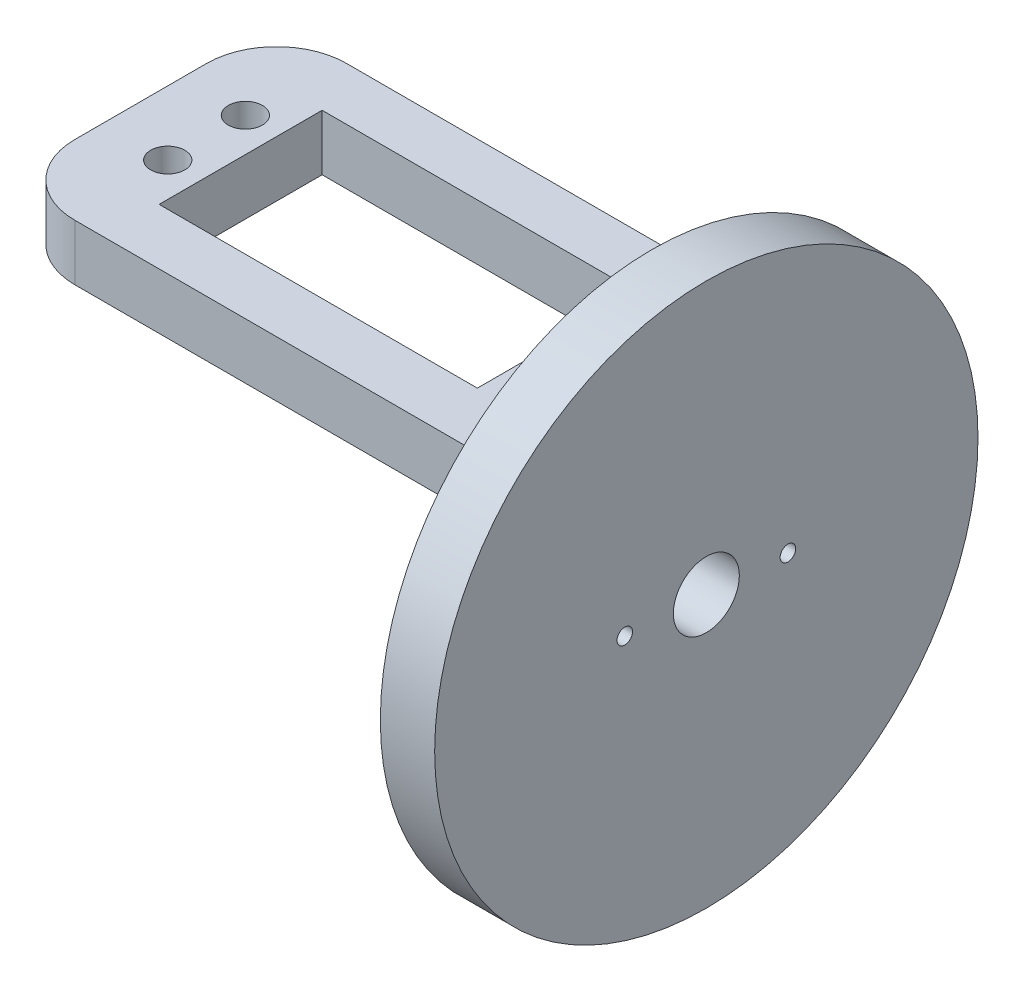
ISO-10303-21;
HEADER;
FILE_DESCRIPTION(('STEP AP214'),'2;1');
FILE_NAME('part.step','',(''),(''),'','','');
FILE_SCHEMA(('AUTOMOTIVE_DESIGN { 1 0 10303 214 1 1 1 1 }'));
ENDSEC;
DATA;
#1=APPLICATION_CONTEXT('core data for automotive mechanical design processes');
#2=APPLICATION_PROTOCOL_DEFINITION('international standard','automotive_design',2000,#1);
#3=PRODUCT_CONTEXT('',#1,'mechanical');
#4=PRODUCT('Part','Part','',(#3));
#5=PRODUCT_RELATED_PRODUCT_CATEGORY('part','',(#4));
#6=PRODUCT_DEFINITION_FORMATION('','',#4);
#7=PRODUCT_DEFINITION_CONTEXT('part definition',#1,'design');
#8=PRODUCT_DEFINITION('design','',#6,#7);
#9=PRODUCT_DEFINITION_SHAPE('','',#8);
#10=(LENGTH_UNIT() NAMED_UNIT(*) SI_UNIT(.MILLI.,.METRE.));
#11=(NAMED_UNIT(*) PLANE_ANGLE_UNIT() SI_UNIT($,.RADIAN.));
#12=(NAMED_UNIT(*) SI_UNIT($,.STERADIAN.) SOLID_ANGLE_UNIT());
#13=UNCERTAINTY_MEASURE_WITH_UNIT(LENGTH_MEASURE(1.E-05),#10,'distance_accuracy_value','');
#14=(GEOMETRIC_REPRESENTATION_CONTEXT(3) GLOBAL_UNCERTAINTY_ASSIGNED_CONTEXT((#13)) GLOBAL_UNIT_ASSIGNED_CONTEXT((#10,
#11,#12)) REPRESENTATION_CONTEXT('',''));
#15=CARTESIAN_POINT('',(0.,0.,0.));
#16=DIRECTION('',(0.,0.,1.));
#17=DIRECTION('',(1.,0.,0.));
#18=AXIS2_PLACEMENT_3D('',#15,#16,#17);
#19=CARTESIAN_POINT('',(-47.8051071083567,7.2,-16.6319835709951));
#20=DIRECTION('',(1.,0.,0.));
#21=DIRECTION('',(0.,0.,-1.));
#22=AXIS2_PLACEMENT_3D('',#19,#20,#21);
#23=PLANE('',#22);
#24=DIRECTION('',(0.,0.,1.));
#25=VECTOR('',#24,1.);
#26=CARTESIAN_POINT('',(-47.8051071083567,0.,-16.6319835709951));
#27=LINE('',#26,#25);
#28=CARTESIAN_POINT('',(-47.8051071083567,0.,-7.63198357099514));
#29=VERTEX_POINT('',#28);
#30=CARTESIAN_POINT('',(-47.8051071083567,0.,9.36801642900486));
#31=VERTEX_POINT('',#30);
#32=EDGE_CURVE('E167',#29,#31,#27,.T.);
#33=ORIENTED_EDGE('',*,*,#32,.T.);
#34=DIRECTION('',(0.,-1.,0.));
#35=VECTOR('',#34,1.);
#36=CARTESIAN_POINT('',(-47.8051071083567,7.2,9.36801642900486));
#37=LINE('',#36,#35);
#38=CARTESIAN_POINT('',(-47.8051071083567,7.2,9.36801642900486));
#39=VERTEX_POINT('',#38);
#40=EDGE_CURVE('E206',#31,#39,#37,.F.);
#41=ORIENTED_EDGE('',*,*,#40,.T.);
#42=DIRECTION('',(0.,0.,1.));
#43=VECTOR('',#42,1.);
#44=CARTESIAN_POINT('',(-47.8051071083567,7.2,-16.6319835709951));
#45=LINE('',#44,#43);
#46=CARTESIAN_POINT('',(-47.8051071083567,7.2,-7.63198357099514));
#47=VERTEX_POINT('',#46);
#48=EDGE_CURVE('E170',#47,#39,#45,.T.);
#49=ORIENTED_EDGE('',*,*,#48,.F.);
#50=DIRECTION('',(0.,-1.,0.));
#51=VECTOR('',#50,1.);
#52=CARTESIAN_POINT('',(-47.8051071083567,7.2,-7.63198357099514));
#53=LINE('',#52,#51);
#54=EDGE_CURVE('E203',#47,#29,#53,.T.);
#55=ORIENTED_EDGE('',*,*,#54,.T.);
#56=EDGE_LOOP('',(#33,#41,#49,#55));
#57=FACE_BOUND('',#56,.T.);
#58=ADVANCED_FACE('F33',(#57),#23,.F.);
#59=CARTESIAN_POINT('',(-47.8051071083567,7.2,18.3680164290049));
#60=DIRECTION('',(0.,0.,-1.));
#61=DIRECTION('',(-1.,0.,0.));
#62=AXIS2_PLACEMENT_3D('',#59,#60,#61);
#63=PLANE('',#62);
#64=DIRECTION('',(1.,0.,0.));
#65=VECTOR('',#64,1.);
#66=CARTESIAN_POINT('',(-47.8051071083567,7.2,18.3680164290049));
#67=LINE('',#66,#65);
#68=CARTESIAN_POINT('',(-38.8051071083567,7.2,18.3680164290049));
#69=VERTEX_POINT('',#68);
#70=CARTESIAN_POINT('',(17.1948928916433,7.2,18.3680164290049));
#71=VERTEX_POINT('',#70);
#72=EDGE_CURVE('E173',#69,#71,#67,.T.);
#73=ORIENTED_EDGE('',*,*,#72,.F.);
#74=DIRECTION('',(0.,-1.,0.));
#75=VECTOR('',#74,1.);
#76=CARTESIAN_POINT('',(-38.8051071083567,7.2,18.3680164290049));
#77=LINE('',#76,#75);
#78=CARTESIAN_POINT('',(-38.8051071083567,0.,18.3680164290049));
#79=VERTEX_POINT('',#78);
#80=EDGE_CURVE('E196',#69,#79,#77,.T.);
#81=ORIENTED_EDGE('',*,*,#80,.T.);
#82=DIRECTION('',(1.,0.,0.));
#83=VECTOR('',#82,1.);
#84=CARTESIAN_POINT('',(-47.8051071083567,0.,18.3680164290049));
#85=LINE('',#84,#83);
#86=CARTESIAN_POINT('',(17.1948928916433,0.,18.3680164290049));
#87=VERTEX_POINT('',#86);
#88=EDGE_CURVE('E184',#79,#87,#85,.T.);
#89=ORIENTED_EDGE('',*,*,#88,.T.);
#90=DIRECTION('',(0.,-1.,0.));
#91=VECTOR('',#90,1.);
#92=CARTESIAN_POINT('',(17.1948928916433,7.2,18.3680164290049));
#93=LINE('',#92,#91);
#94=EDGE_CURVE('E193',#71,#87,#93,.T.);
#95=ORIENTED_EDGE('',*,*,#94,.F.);
#96=EDGE_LOOP('',(#73,#81,#89,#95));
#97=FACE_BOUND('',#96,.T.);
#98=ADVANCED_FACE('F219',(#97),#63,.F.);
#99=CARTESIAN_POINT('',(-47.8051071083567,7.2,-16.6319835709951));
#100=DIRECTION('',(0.,0.,1.));
#101=DIRECTION('',(1.,0.,0.));
#102=AXIS2_PLACEMENT_3D('',#99,#100,#101);
#103=PLANE('',#102);
#104=DIRECTION('',(-1.,0.,0.));
#105=VECTOR('',#104,1.);
#106=CARTESIAN_POINT('',(-47.8051071083567,0.,-16.6319835709951));
#107=LINE('',#106,#105);
#108=CARTESIAN_POINT('',(17.1948928916433,0.,-16.6319835709951));
#109=VERTEX_POINT('',#108);
#110=CARTESIAN_POINT('',(-38.8051071083567,0.,-16.6319835709951));
#111=VERTEX_POINT('',#110);
#112=EDGE_CURVE('E174',#109,#111,#107,.T.);
#113=ORIENTED_EDGE('',*,*,#112,.T.);
#114=DIRECTION('',(0.,-1.,0.));
#115=VECTOR('',#114,1.);
#116=CARTESIAN_POINT('',(-38.8051071083567,7.2,-16.6319835709951));
#117=LINE('',#116,#115);
#118=CARTESIAN_POINT('',(-38.8051071083567,7.2,-16.6319835709951));
#119=VERTEX_POINT('',#118);
#120=EDGE_CURVE('E11',#111,#119,#117,.F.);
#121=ORIENTED_EDGE('',*,*,#120,.T.);
#122=DIRECTION('',(-1.,0.,0.));
#123=VECTOR('',#122,1.);
#124=CARTESIAN_POINT('',(-47.8051071083567,7.2,-16.6319835709951));
#125=LINE('',#124,#123);
#126=CARTESIAN_POINT('',(17.1948928916433,7.2,-16.6319835709951));
#127=VERTEX_POINT('',#126);
#128=EDGE_CURVE('E178',#127,#119,#125,.T.);
#129=ORIENTED_EDGE('',*,*,#128,.F.);
#130=DIRECTION('',(0.,-1.,0.));
#131=VECTOR('',#130,1.);
#132=CARTESIAN_POINT('',(17.1948928916433,7.2,-16.6319835709951));
#133=LINE('',#132,#131);
#134=EDGE_CURVE('E181',#127,#109,#133,.T.);
#135=ORIENTED_EDGE('',*,*,#134,.T.);
#136=EDGE_LOOP('',(#113,#121,#129,#135));
#137=FACE_BOUND('',#136,.T.);
#138=ADVANCED_FACE('F231',(#137),#103,.F.);
#139=CARTESIAN_POINT('',(0.,7.2,0.));
#140=DIRECTION('',(0.,1.,0.));
#141=DIRECTION('',(0.,0.,1.));
#142=AXIS2_PLACEMENT_3D('',#139,#140,#141);
#143=PLANE('',#142);
#144=CARTESIAN_POINT('',(-39.5254301155466,7.2,-4.33198357099514));
#145=DIRECTION('',(0.,1.,0.));
#146=DIRECTION('',(0.,0.,1.));
#147=AXIS2_PLACEMENT_3D('',#144,#145,#146);
#148=CIRCLE('',#147,2.20000000006193);
#149=CARTESIAN_POINT('',(-39.5254301155466,7.2,-2.13198357093321));
#150=VERTEX_POINT('',#149);
#151=EDGE_CURVE('E422',#150,#150,#148,.T.);
#152=ORIENTED_EDGE('',*,*,#151,.F.);
#153=EDGE_LOOP('',(#152));
#154=FACE_BOUND('',#153,.T.);
#155=CARTESIAN_POINT('',(-39.5254301155466,7.2,5.66801642900486));
#156=DIRECTION('',(0.,1.,0.));
#157=DIRECTION('',(0.,0.,1.));
#158=AXIS2_PLACEMENT_3D('',#155,#156,#157);
#159=CIRCLE('',#158,2.2000000001223);
#160=CARTESIAN_POINT('',(-39.5254301155466,7.2,7.86801642912716));
#161=VERTEX_POINT('',#160);
#162=EDGE_CURVE('E425',#161,#161,#159,.T.);
#163=ORIENTED_EDGE('',*,*,#162,.F.);
#164=EDGE_LOOP('',(#163));
#165=FACE_BOUND('',#164,.T.);
#166=CARTESIAN_POINT('',(10.2537964864071,7.2,5.66801642900484));
#167=DIRECTION('',(0.,1.,0.));
#168=DIRECTION('',(0.,0.,1.));
#169=AXIS2_PLACEMENT_3D('',#166,#167,#168);
#170=CIRCLE('',#169,2.20000000006728);
#171=CARTESIAN_POINT('',(10.2537964864071,7.2,7.86801642907212));
#172=VERTEX_POINT('',#171);
#173=EDGE_CURVE('E442',#172,#172,#170,.T.);
#174=ORIENTED_EDGE('',*,*,#173,.F.);
#175=EDGE_LOOP('',(#174));
#176=FACE_BOUND('',#175,.T.);
#177=CARTESIAN_POINT('',(10.2571502329024,7.2,-4.32491084017674));
#178=DIRECTION('',(0.,1.,0.));
#179=DIRECTION('',(0.,0.,1.));
#180=AXIS2_PLACEMENT_3D('',#177,#178,#179);
#181=CIRCLE('',#180,2.19217241181564);
#182=CARTESIAN_POINT('',(10.2571502329024,7.2,-2.1327384283611));
#183=VERTEX_POINT('',#182);
#184=EDGE_CURVE('E434',#183,#183,#181,.T.);
#185=ORIENTED_EDGE('',*,*,#184,.F.);
#186=EDGE_LOOP('',(#185));
#187=FACE_BOUND('',#186,.T.);
#188=DIRECTION('',(0.,0.,-1.));
#189=VECTOR('',#188,1.);
#190=CARTESIAN_POINT('',(5.86418318543995,7.2,-9.83198357100003));
#191=LINE('',#190,#189);
#192=CARTESIAN_POINT('',(5.86418318543995,7.2,11.168016429));
#193=VERTEX_POINT('',#192);
#194=CARTESIAN_POINT('',(5.86418318543995,7.2,-9.83198357100003));
#195=VERTEX_POINT('',#194);
#196=EDGE_CURVE('E48',#193,#195,#191,.T.);
#197=ORIENTED_EDGE('',*,*,#196,.F.);
#198=DIRECTION('',(1.,0.,0.));
#199=VECTOR('',#198,1.);
#200=CARTESIAN_POINT('',(-35.1358168145601,7.2,11.168016429));
#201=LINE('',#200,#199);
#202=CARTESIAN_POINT('',(-35.1358168145601,7.2,11.168016429));
#203=VERTEX_POINT('',#202);
#204=EDGE_CURVE('E117',#203,#193,#201,.T.);
#205=ORIENTED_EDGE('',*,*,#204,.F.);
#206=DIRECTION('',(0.,0.,1.));
#207=VECTOR('',#206,1.);
#208=CARTESIAN_POINT('',(-35.1358168145601,7.2,-9.83198357100003));
#209=LINE('',#208,#207);
#210=CARTESIAN_POINT('',(-35.1358168145601,7.2,-9.83198357100003));
#211=VERTEX_POINT('',#210);
#212=EDGE_CURVE('E137',#211,#203,#209,.T.);
#213=ORIENTED_EDGE('',*,*,#212,.F.);
#214=DIRECTION('',(-1.,0.,0.));
#215=VECTOR('',#214,1.);
#216=CARTESIAN_POINT('',(-35.1358168145601,7.2,-9.83198357100003));
#217=LINE('',#216,#215);
#218=EDGE_CURVE('E131',#195,#211,#217,.T.);
#219=ORIENTED_EDGE('',*,*,#218,.F.);
#220=EDGE_LOOP('',(#197,#205,#213,#219));
#221=FACE_BOUND('',#220,.T.);
#222=ORIENTED_EDGE('',*,*,#48,.T.);
#223=CARTESIAN_POINT('',(-38.8051071083567,7.2,9.36801642900486));
#224=DIRECTION('',(0.,1.,0.));
#225=DIRECTION('',(0.,0.,1.));
#226=AXIS2_PLACEMENT_3D('',#223,#224,#225);
#227=CIRCLE('',#226,9.);
#228=EDGE_CURVE('E41',#39,#69,#227,.T.);
#229=ORIENTED_EDGE('',*,*,#228,.T.);
#230=ORIENTED_EDGE('',*,*,#72,.T.);
#231=DIRECTION('',(0.,0.,-1.));
#232=VECTOR('',#231,1.);
#233=CARTESIAN_POINT('',(17.1948928916433,7.2,-16.6319835709951));
#234=LINE('',#233,#232);
#235=EDGE_CURVE('E176',#71,#127,#234,.T.);
#236=ORIENTED_EDGE('',*,*,#235,.T.);
#237=ORIENTED_EDGE('',*,*,#128,.T.);
#238=CARTESIAN_POINT('',(-38.8051071083567,7.2,-7.63198357099514));
#239=DIRECTION('',(0.,1.,0.));
#240=DIRECTION('',(0.,0.,1.));
#241=AXIS2_PLACEMENT_3D('',#238,#239,#240);
#242=CIRCLE('',#241,9.);
#243=EDGE_CURVE('E208',#119,#47,#242,.T.);
#244=ORIENTED_EDGE('',*,*,#243,.T.);
#245=EDGE_LOOP('',(#222,#229,#230,#236,#237,#244));
#246=FACE_BOUND('',#245,.T.);
#247=ADVANCED_FACE('F212',(#154,#165,#176,#187,#221,#246),#143,.T.);
#248=CARTESIAN_POINT('',(0.,0.,0.));
#249=DIRECTION('',(0.,1.,0.));
#250=DIRECTION('',(0.,0.,1.));
#251=AXIS2_PLACEMENT_3D('',#248,#249,#250);
#252=PLANE('',#251);
#253=CARTESIAN_POINT('',(-39.5254301155466,0.,-4.33198357099514));
#254=DIRECTION('',(0.,1.,0.));
#255=DIRECTION('',(0.,0.,1.));
#256=AXIS2_PLACEMENT_3D('',#253,#254,#255);
#257=CIRCLE('',#256,2.20000000006193);
#258=CARTESIAN_POINT('',(-39.5254301155466,0.,-2.13198357093321));
#259=VERTEX_POINT('',#258);
#260=EDGE_CURVE('E424',#259,#259,#257,.F.);
#261=ORIENTED_EDGE('',*,*,#260,.F.);
#262=EDGE_LOOP('',(#261));
#263=FACE_BOUND('',#262,.T.);
#264=CARTESIAN_POINT('',(-39.5254301155466,0.,5.66801642900486));
#265=DIRECTION('',(0.,1.,0.));
#266=DIRECTION('',(0.,0.,1.));
#267=AXIS2_PLACEMENT_3D('',#264,#265,#266);
#268=CIRCLE('',#267,2.2000000001223);
#269=CARTESIAN_POINT('',(-39.5254301155466,0.,7.86801642912716));
#270=VERTEX_POINT('',#269);
#271=EDGE_CURVE('E428',#270,#270,#268,.F.);
#272=ORIENTED_EDGE('',*,*,#271,.F.);
#273=EDGE_LOOP('',(#272));
#274=FACE_BOUND('',#273,.T.);
#275=CARTESIAN_POINT('',(10.2537964864071,0.,5.66801642900484));
#276=DIRECTION('',(0.,1.,0.));
#277=DIRECTION('',(0.,0.,1.));
#278=AXIS2_PLACEMENT_3D('',#275,#276,#277);
#279=CIRCLE('',#278,2.20000000006728);
#280=CARTESIAN_POINT('',(10.2537964864071,0.,7.86801642907212));
#281=VERTEX_POINT('',#280);
#282=EDGE_CURVE('E439',#281,#281,#279,.F.);
#283=ORIENTED_EDGE('',*,*,#282,.F.);
#284=EDGE_LOOP('',(#283));
#285=FACE_BOUND('',#284,.T.);
#286=CARTESIAN_POINT('',(10.2571502329024,0.,-4.32491084017674));
#287=DIRECTION('',(0.,1.,0.));
#288=DIRECTION('',(0.,0.,1.));
#289=AXIS2_PLACEMENT_3D('',#286,#287,#288);
#290=CIRCLE('',#289,2.19217241181564);
#291=CARTESIAN_POINT('',(10.2571502329024,0.,-2.1327384283611));
#292=VERTEX_POINT('',#291);
#293=EDGE_CURVE('E432',#292,#292,#290,.F.);
#294=ORIENTED_EDGE('',*,*,#293,.F.);
#295=EDGE_LOOP('',(#294));
#296=FACE_BOUND('',#295,.T.);
#297=DIRECTION('',(-1.,0.,0.));
#298=VECTOR('',#297,1.);
#299=CARTESIAN_POINT('',(-35.1358168145601,0.,11.168016429));
#300=LINE('',#299,#298);
#301=CARTESIAN_POINT('',(5.86418318543995,0.,11.168016429));
#302=VERTEX_POINT('',#301);
#303=CARTESIAN_POINT('',(-35.1358168145601,0.,11.168016429));
#304=VERTEX_POINT('',#303);
#305=EDGE_CURVE('E129',#302,#304,#300,.T.);
#306=ORIENTED_EDGE('',*,*,#305,.F.);
#307=DIRECTION('',(0.,0.,1.));
#308=VECTOR('',#307,1.);
#309=CARTESIAN_POINT('',(5.86418318543995,0.,-9.83198357100003));
#310=LINE('',#309,#308);
#311=CARTESIAN_POINT('',(5.86418318543995,0.,-9.83198357100003));
#312=VERTEX_POINT('',#311);
#313=EDGE_CURVE('E111',#312,#302,#310,.T.);
#314=ORIENTED_EDGE('',*,*,#313,.F.);
#315=DIRECTION('',(1.,0.,0.));
#316=VECTOR('',#315,1.);
#317=CARTESIAN_POINT('',(-35.1358168145601,0.,-9.83198357100003));
#318=LINE('',#317,#316);
#319=CARTESIAN_POINT('',(-35.1358168145601,0.,-9.83198357100003));
#320=VERTEX_POINT('',#319);
#321=EDGE_CURVE('E120',#320,#312,#318,.T.);
#322=ORIENTED_EDGE('',*,*,#321,.F.);
#323=DIRECTION('',(0.,0.,-1.));
#324=VECTOR('',#323,1.);
#325=CARTESIAN_POINT('',(-35.1358168145601,0.,-9.83198357100003));
#326=LINE('',#325,#324);
#327=EDGE_CURVE('E56',#304,#320,#326,.T.);
#328=ORIENTED_EDGE('',*,*,#327,.F.);
#329=EDGE_LOOP('',(#306,#314,#322,#328));
#330=FACE_BOUND('',#329,.T.);
#331=ORIENTED_EDGE('',*,*,#88,.F.);
#332=CARTESIAN_POINT('',(-38.8051071083567,0.,9.36801642900486));
#333=DIRECTION('',(0.,1.,0.));
#334=DIRECTION('',(0.,0.,1.));
#335=AXIS2_PLACEMENT_3D('',#332,#333,#334);
#336=CIRCLE('',#335,9.);
#337=EDGE_CURVE('E201',#79,#31,#336,.F.);
#338=ORIENTED_EDGE('',*,*,#337,.T.);
#339=ORIENTED_EDGE('',*,*,#32,.F.);
#340=CARTESIAN_POINT('',(-38.8051071083567,0.,-7.63198357099514));
#341=DIRECTION('',(0.,1.,0.));
#342=DIRECTION('',(0.,0.,1.));
#343=AXIS2_PLACEMENT_3D('',#340,#341,#342);
#344=CIRCLE('',#343,9.);
#345=EDGE_CURVE('E199',#29,#111,#344,.F.);
#346=ORIENTED_EDGE('',*,*,#345,.T.);
#347=ORIENTED_EDGE('',*,*,#112,.F.);
#348=DIRECTION('',(0.,0.,-1.));
#349=VECTOR('',#348,1.);
#350=CARTESIAN_POINT('',(17.1948928916433,0.,-16.6319835709951));
#351=LINE('',#350,#349);
#352=EDGE_CURVE('E187',#87,#109,#351,.T.);
#353=ORIENTED_EDGE('',*,*,#352,.F.);
#354=EDGE_LOOP('',(#331,#338,#339,#346,#347,#353));
#355=FACE_BOUND('',#354,.T.);
#356=ADVANCED_FACE('F126',(#263,#274,#285,#296,#330,#355),#252,.F.);
#357=CARTESIAN_POINT('',(-38.8051071083567,7.2,9.36801642900486));
#358=DIRECTION('',(0.,-1.,0.));
#359=DIRECTION('',(0.,0.,-1.));
#360=AXIS2_PLACEMENT_3D('',#357,#358,#359);
#361=CYLINDRICAL_SURFACE('',#360,9.);
#362=ORIENTED_EDGE('',*,*,#228,.F.);
#363=ORIENTED_EDGE('',*,*,#40,.F.);
#364=ORIENTED_EDGE('',*,*,#337,.F.);
#365=ORIENTED_EDGE('',*,*,#80,.F.);
#366=EDGE_LOOP('',(#362,#363,#364,#365));
#367=FACE_BOUND('',#366,.T.);
#368=ADVANCED_FACE('F222',(#367),#361,.T.);
#369=CARTESIAN_POINT('',(-38.8051071083567,7.2,-7.63198357099514));
#370=DIRECTION('',(0.,-1.,0.));
#371=DIRECTION('',(0.,0.,-1.));
#372=AXIS2_PLACEMENT_3D('',#369,#370,#371);
#373=CYLINDRICAL_SURFACE('',#372,9.);
#374=ORIENTED_EDGE('',*,*,#243,.F.);
#375=ORIENTED_EDGE('',*,*,#120,.F.);
#376=ORIENTED_EDGE('',*,*,#345,.F.);
#377=ORIENTED_EDGE('',*,*,#54,.F.);
#378=EDGE_LOOP('',(#374,#375,#376,#377));
#379=FACE_BOUND('',#378,.T.);
#380=ADVANCED_FACE('F35',(#379),#373,.T.);
#381=CARTESIAN_POINT('',(17.1948928916433,-12.2514479748668,0.));
#382=DIRECTION('',(1.,0.,0.));
#383=DIRECTION('',(0.,0.,-1.));
#384=AXIS2_PLACEMENT_3D('',#381,#382,#383);
#385=PLANE('',#384);
#386=CARTESIAN_POINT('',(17.1948928916433,-11.6281200143779,10.5115347239911));
#387=DIRECTION('',(-1.,0.,0.));
#388=DIRECTION('',(0.,0.,1.));
#389=AXIS2_PLACEMENT_3D('',#386,#387,#388);
#390=CIRCLE('',#389,0.999999999999999);
#391=CARTESIAN_POINT('',(17.1948928916433,-11.6281200143779,11.5115347239911));
#392=VERTEX_POINT('',#391);
#393=EDGE_CURVE('E153',#392,#392,#390,.T.);
#394=ORIENTED_EDGE('',*,*,#393,.F.);
#395=EDGE_LOOP('',(#394));
#396=FACE_BOUND('',#395,.T.);
#397=CARTESIAN_POINT('',(17.1948928916433,-12.8747759353553,-10.5115347239914));
#398=DIRECTION('',(-1.,0.,0.));
#399=DIRECTION('',(0.,0.,1.));
#400=AXIS2_PLACEMENT_3D('',#397,#398,#399);
#401=CIRCLE('',#400,1.);
#402=CARTESIAN_POINT('',(17.1948928916433,-12.8747759353553,-9.51153472399137));
#403=VERTEX_POINT('',#402);
#404=EDGE_CURVE('E146',#403,#403,#401,.T.);
#405=ORIENTED_EDGE('',*,*,#404,.F.);
#406=EDGE_LOOP('',(#405));
#407=FACE_BOUND('',#406,.T.);
#408=CARTESIAN_POINT('',(17.1948928916433,-12.2514479748666,-1.55058567676949E-13));
#409=DIRECTION('',(-1.,0.,0.));
#410=DIRECTION('',(0.,0.,1.));
#411=AXIS2_PLACEMENT_3D('',#408,#409,#410);
#412=CIRCLE('',#411,4.25);
#413=CARTESIAN_POINT('',(17.1948928916433,-12.2514479748666,4.24999999999985));
#414=VERTEX_POINT('',#413);
#415=EDGE_CURVE('E158',#414,#414,#412,.T.);
#416=ORIENTED_EDGE('',*,*,#415,.F.);
#417=EDGE_LOOP('',(#416));
#418=FACE_BOUND('',#417,.T.);
#419=CARTESIAN_POINT('',(17.1948928916433,-12.2514479748668,0.));
#420=DIRECTION('',(1.,0.,0.));
#421=DIRECTION('',(0.,0.,-1.));
#422=AXIS2_PLACEMENT_3D('',#419,#420,#421);
#423=CIRCLE('',#422,35.);
#424=CARTESIAN_POINT('',(17.1948928916432,-12.2514479748668,-35.));
#425=VERTEX_POINT('',#424);
#426=EDGE_CURVE('E161',#425,#425,#423,.T.);
#427=ORIENTED_EDGE('',*,*,#426,.F.);
#428=EDGE_LOOP('',(#427));
#429=FACE_BOUND('',#428,.T.);
#430=ORIENTED_EDGE('',*,*,#94,.T.);
#431=ORIENTED_EDGE('',*,*,#352,.T.);
#432=ORIENTED_EDGE('',*,*,#134,.F.);
#433=ORIENTED_EDGE('',*,*,#235,.F.);
#434=EDGE_LOOP('',(#430,#431,#432,#433));
#435=FACE_BOUND('',#434,.T.);
#436=ADVANCED_FACE('F235',(#396,#407,#418,#429,#435),#385,.F.);
#437=CARTESIAN_POINT('',(24.1948928916433,-12.2514479748668,0.));
#438=DIRECTION('',(-1.,0.,0.));
#439=DIRECTION('',(0.,0.,1.));
#440=AXIS2_PLACEMENT_3D('',#437,#438,#439);
#441=CYLINDRICAL_SURFACE('',#440,35.);
#442=CARTESIAN_POINT('',(24.1948928916433,-12.2514479748668,0.));
#443=DIRECTION('',(1.,0.,0.));
#444=DIRECTION('',(0.,0.,-1.));
#445=AXIS2_PLACEMENT_3D('',#442,#443,#444);
#446=CIRCLE('',#445,35.);
#447=CARTESIAN_POINT('',(24.1948928916432,-12.2514479748668,-35.));
#448=VERTEX_POINT('',#447);
#449=EDGE_CURVE('E164',#448,#448,#446,.T.);
#450=ORIENTED_EDGE('',*,*,#449,.F.);
#451=EDGE_LOOP('',(#450));
#452=FACE_BOUND('',#451,.T.);
#453=ORIENTED_EDGE('',*,*,#426,.T.);
#454=EDGE_LOOP('',(#453));
#455=FACE_BOUND('',#454,.T.);
#456=ADVANCED_FACE('F237',(#452,#455),#441,.T.);
#457=CARTESIAN_POINT('',(24.1948928916433,-12.2514479748668,0.));
#458=DIRECTION('',(1.,0.,0.));
#459=DIRECTION('',(0.,0.,-1.));
#460=AXIS2_PLACEMENT_3D('',#457,#458,#459);
#461=PLANE('',#460);
#462=CARTESIAN_POINT('',(24.1948928916433,-11.6281200143779,10.5115347239911));
#463=DIRECTION('',(1.,0.,0.));
#464=DIRECTION('',(0.,0.,-1.));
#465=AXIS2_PLACEMENT_3D('',#462,#463,#464);
#466=CIRCLE('',#465,0.999999999999999);
#467=CARTESIAN_POINT('',(24.1948928916433,-11.6281200143779,9.51153472399106));
#468=VERTEX_POINT('',#467);
#469=EDGE_CURVE('E123',#468,#468,#466,.F.);
#470=ORIENTED_EDGE('',*,*,#469,.T.);
#471=EDGE_LOOP('',(#470));
#472=FACE_BOUND('',#471,.T.);
#473=CARTESIAN_POINT('',(24.1948928916433,-12.8747759353553,-10.5115347239914));
#474=DIRECTION('',(1.,0.,0.));
#475=DIRECTION('',(0.,0.,-1.));
#476=AXIS2_PLACEMENT_3D('',#473,#474,#475);
#477=CIRCLE('',#476,1.);
#478=CARTESIAN_POINT('',(24.1948928916433,-12.8747759353553,-11.5115347239914));
#479=VERTEX_POINT('',#478);
#480=EDGE_CURVE('E150',#479,#479,#477,.F.);
#481=ORIENTED_EDGE('',*,*,#480,.T.);
#482=EDGE_LOOP('',(#481));
#483=FACE_BOUND('',#482,.T.);
#484=CARTESIAN_POINT('',(24.1948928916433,-12.2514479748666,-1.56014714474731E-13));
#485=DIRECTION('',(1.,0.,0.));
#486=DIRECTION('',(0.,0.,-1.));
#487=AXIS2_PLACEMENT_3D('',#484,#485,#486);
#488=CIRCLE('',#487,4.25);
#489=CARTESIAN_POINT('',(24.1948928916433,-12.2514479748666,-4.25000000000016));
#490=VERTEX_POINT('',#489);
#491=EDGE_CURVE('E149',#490,#490,#488,.F.);
#492=ORIENTED_EDGE('',*,*,#491,.T.);
#493=EDGE_LOOP('',(#492));
#494=FACE_BOUND('',#493,.T.);
#495=ORIENTED_EDGE('',*,*,#449,.T.);
#496=EDGE_LOOP('',(#495));
#497=FACE_BOUND('',#496,.T.);
#498=ADVANCED_FACE('F244',(#472,#483,#494,#497),#461,.T.);
#499=CARTESIAN_POINT('',(24.1958928916433,-12.2514479748666,-1.56014851067131E-13));
#500=DIRECTION('',(-1.,0.,0.));
#501=DIRECTION('',(0.,0.,1.));
#502=AXIS2_PLACEMENT_3D('',#499,#500,#501);
#503=CYLINDRICAL_SURFACE('',#502,4.25);
#504=ORIENTED_EDGE('',*,*,#491,.F.);
#505=EDGE_LOOP('',(#504));
#506=FACE_BOUND('',#505,.T.);
#507=ORIENTED_EDGE('',*,*,#415,.T.);
#508=EDGE_LOOP('',(#507));
#509=FACE_BOUND('',#508,.T.);
#510=ADVANCED_FACE('F313',(#506,#509),#503,.F.);
#511=CARTESIAN_POINT('',(24.1958928916433,-12.8747759353553,-10.5115347239914));
#512=DIRECTION('',(-1.,0.,0.));
#513=DIRECTION('',(0.,0.,1.));
#514=AXIS2_PLACEMENT_3D('',#511,#512,#513);
#515=CYLINDRICAL_SURFACE('',#514,1.);
#516=ORIENTED_EDGE('',*,*,#480,.F.);
#517=EDGE_LOOP('',(#516));
#518=FACE_BOUND('',#517,.T.);
#519=ORIENTED_EDGE('',*,*,#404,.T.);
#520=EDGE_LOOP('',(#519));
#521=FACE_BOUND('',#520,.T.);
#522=ADVANCED_FACE('F321',(#518,#521),#515,.F.);
#523=CARTESIAN_POINT('',(24.1958928916433,-11.6281200143779,10.5115347239911));
#524=DIRECTION('',(-1.,0.,0.));
#525=DIRECTION('',(0.,0.,1.));
#526=AXIS2_PLACEMENT_3D('',#523,#524,#525);
#527=CYLINDRICAL_SURFACE('',#526,0.999999999999999);
#528=ORIENTED_EDGE('',*,*,#469,.F.);
#529=EDGE_LOOP('',(#528));
#530=FACE_BOUND('',#529,.T.);
#531=ORIENTED_EDGE('',*,*,#393,.T.);
#532=EDGE_LOOP('',(#531));
#533=FACE_BOUND('',#532,.T.);
#534=ADVANCED_FACE('F330',(#530,#533),#527,.F.);
#535=CARTESIAN_POINT('',(5.86418318543995,-47.2524479748668,-9.83198357100003));
#536=DIRECTION('',(1.,0.,0.));
#537=DIRECTION('',(0.,0.,-1.));
#538=AXIS2_PLACEMENT_3D('',#535,#536,#537);
#539=PLANE('',#538);
#540=ORIENTED_EDGE('',*,*,#313,.T.);
#541=DIRECTION('',(0.,1.,0.));
#542=VECTOR('',#541,1.);
#543=CARTESIAN_POINT('',(5.86418318543995,-47.2524479748668,11.168016429));
#544=LINE('',#543,#542);
#545=EDGE_CURVE('E124',#302,#193,#544,.T.);
#546=ORIENTED_EDGE('',*,*,#545,.T.);
#547=ORIENTED_EDGE('',*,*,#196,.T.);
#548=DIRECTION('',(0.,1.,0.));
#549=VECTOR('',#548,1.);
#550=CARTESIAN_POINT('',(5.86418318543995,-47.2524479748668,-9.83198357100003));
#551=LINE('',#550,#549);
#552=EDGE_CURVE('E107',#312,#195,#551,.T.);
#553=ORIENTED_EDGE('',*,*,#552,.F.);
#554=EDGE_LOOP('',(#540,#546,#547,#553));
#555=FACE_BOUND('',#554,.T.);
#556=ADVANCED_FACE('F109',(#555),#539,.F.);
#557=CARTESIAN_POINT('',(-35.1358168145601,-47.2524479748668,11.168016429));
#558=DIRECTION('',(0.,0.,1.));
#559=DIRECTION('',(1.,0.,0.));
#560=AXIS2_PLACEMENT_3D('',#557,#558,#559);
#561=PLANE('',#560);
#562=ORIENTED_EDGE('',*,*,#305,.T.);
#563=DIRECTION('',(0.,1.,0.));
#564=VECTOR('',#563,1.);
#565=CARTESIAN_POINT('',(-35.1358168145601,-47.2524479748668,11.168016429));
#566=LINE('',#565,#564);
#567=EDGE_CURVE('E143',#304,#203,#566,.T.);
#568=ORIENTED_EDGE('',*,*,#567,.T.);
#569=ORIENTED_EDGE('',*,*,#204,.T.);
#570=ORIENTED_EDGE('',*,*,#545,.F.);
#571=EDGE_LOOP('',(#562,#568,#569,#570));
#572=FACE_BOUND('',#571,.T.);
#573=ADVANCED_FACE('F345',(#572),#561,.F.);
#574=CARTESIAN_POINT('',(-35.1358168145601,-47.2524479748668,-9.83198357100003));
#575=DIRECTION('',(-1.,0.,0.));
#576=DIRECTION('',(0.,0.,1.));
#577=AXIS2_PLACEMENT_3D('',#574,#575,#576);
#578=PLANE('',#577);
#579=ORIENTED_EDGE('',*,*,#327,.T.);
#580=DIRECTION('',(0.,1.,0.));
#581=VECTOR('',#580,1.);
#582=CARTESIAN_POINT('',(-35.1358168145601,-47.2524479748668,-9.83198357100003));
#583=LINE('',#582,#581);
#584=EDGE_CURVE('E116',#320,#211,#583,.T.);
#585=ORIENTED_EDGE('',*,*,#584,.T.);
#586=ORIENTED_EDGE('',*,*,#212,.T.);
#587=ORIENTED_EDGE('',*,*,#567,.F.);
#588=EDGE_LOOP('',(#579,#585,#586,#587));
#589=FACE_BOUND('',#588,.T.);
#590=ADVANCED_FACE('F353',(#589),#578,.F.);
#591=CARTESIAN_POINT('',(-35.1358168145601,-47.2524479748668,-9.83198357100003));
#592=DIRECTION('',(0.,0.,-1.));
#593=DIRECTION('',(-1.,0.,0.));
#594=AXIS2_PLACEMENT_3D('',#591,#592,#593);
#595=PLANE('',#594);
#596=ORIENTED_EDGE('',*,*,#321,.T.);
#597=ORIENTED_EDGE('',*,*,#552,.T.);
#598=ORIENTED_EDGE('',*,*,#218,.T.);
#599=ORIENTED_EDGE('',*,*,#584,.F.);
#600=EDGE_LOOP('',(#596,#597,#598,#599));
#601=FACE_BOUND('',#600,.T.);
#602=ADVANCED_FACE('F121',(#601),#595,.F.);
#603=CARTESIAN_POINT('',(10.2571502329024,-47.2524479748668,-4.32491084017674));
#604=DIRECTION('',(0.,1.,0.));
#605=DIRECTION('',(0.,0.,1.));
#606=AXIS2_PLACEMENT_3D('',#603,#604,#605);
#607=CYLINDRICAL_SURFACE('',#606,2.19217241181564);
#608=CARTESIAN_POINT('',(10.2571502329024,7.2,-2.1327384283611));
#609=CARTESIAN_POINT('',(10.2571502329024,7.125,-2.1327384283611));
#610=CARTESIAN_POINT('',(10.2571502329024,7.05,-2.1327384283611));
#611=CARTESIAN_POINT('',(10.2571502329024,6.9,-2.1327384283611));
#612=CARTESIAN_POINT('',(10.2571502329024,6.825,-2.1327384283611));
#613=CARTESIAN_POINT('',(10.2571502329024,6.67500000000001,-2.1327384283611));
#614=CARTESIAN_POINT('',(10.2571502329024,6.6,-2.1327384283611));
#615=CARTESIAN_POINT('',(10.2571502329024,6.45,-2.1327384283611));
#616=CARTESIAN_POINT('',(10.2571502329024,6.37500000000001,-2.1327384283611));
#617=CARTESIAN_POINT('',(10.2571502329024,6.22500000000001,-2.1327384283611));
#618=CARTESIAN_POINT('',(10.2571502329024,6.15000000000001,-2.1327384283611));
#619=CARTESIAN_POINT('',(10.2571502329024,6.,-2.1327384283611));
#620=CARTESIAN_POINT('',(10.2571502329024,5.925,-2.1327384283611));
#621=CARTESIAN_POINT('',(10.2571502329024,5.775,-2.1327384283611));
#622=CARTESIAN_POINT('',(10.2571502329024,5.7,-2.1327384283611));
#623=CARTESIAN_POINT('',(10.2571502329024,5.55,-2.1327384283611));
#624=CARTESIAN_POINT('',(10.2571502329024,5.475,-2.1327384283611));
#625=CARTESIAN_POINT('',(10.2571502329024,5.325,-2.1327384283611));
#626=CARTESIAN_POINT('',(10.2571502329024,5.25,-2.1327384283611));
#627=CARTESIAN_POINT('',(10.2571502329024,5.1,-2.1327384283611));
#628=CARTESIAN_POINT('',(10.2571502329024,5.025,-2.1327384283611));
#629=CARTESIAN_POINT('',(10.2571502329024,4.875,-2.1327384283611));
#630=CARTESIAN_POINT('',(10.2571502329024,4.8,-2.1327384283611));
#631=CARTESIAN_POINT('',(10.2571502329024,4.65,-2.1327384283611));
#632=CARTESIAN_POINT('',(10.2571502329024,4.575,-2.1327384283611));
#633=CARTESIAN_POINT('',(10.2571502329024,4.425,-2.1327384283611));
#634=CARTESIAN_POINT('',(10.2571502329024,4.35,-2.1327384283611));
#635=CARTESIAN_POINT('',(10.2571502329024,4.2,-2.1327384283611));
#636=CARTESIAN_POINT('',(10.2571502329024,4.125,-2.1327384283611));
#637=CARTESIAN_POINT('',(10.2571502329024,3.975,-2.1327384283611));
#638=CARTESIAN_POINT('',(10.2571502329024,3.9,-2.1327384283611));
#639=CARTESIAN_POINT('',(10.2571502329024,3.75,-2.1327384283611));
#640=CARTESIAN_POINT('',(10.2571502329024,3.675,-2.1327384283611));
#641=CARTESIAN_POINT('',(10.2571502329024,3.525,-2.1327384283611));
#642=CARTESIAN_POINT('',(10.2571502329024,3.45,-2.1327384283611));
#643=CARTESIAN_POINT('',(10.2571502329024,3.3,-2.1327384283611));
#644=CARTESIAN_POINT('',(10.2571502329024,3.225,-2.1327384283611));
#645=CARTESIAN_POINT('',(10.2571502329024,3.075,-2.1327384283611));
#646=CARTESIAN_POINT('',(10.2571502329024,3.,-2.1327384283611));
#647=CARTESIAN_POINT('',(10.2571502329024,2.85,-2.1327384283611));
#648=CARTESIAN_POINT('',(10.2571502329024,2.775,-2.1327384283611));
#649=CARTESIAN_POINT('',(10.2571502329024,2.625,-2.1327384283611));
#650=CARTESIAN_POINT('',(10.2571502329024,2.55,-2.1327384283611));
#651=CARTESIAN_POINT('',(10.2571502329024,2.4,-2.1327384283611));
#652=CARTESIAN_POINT('',(10.2571502329024,2.325,-2.1327384283611));
#653=CARTESIAN_POINT('',(10.2571502329024,2.175,-2.1327384283611));
#654=CARTESIAN_POINT('',(10.2571502329024,2.1,-2.1327384283611));
#655=CARTESIAN_POINT('',(10.2571502329024,1.95,-2.1327384283611));
#656=CARTESIAN_POINT('',(10.2571502329024,1.875,-2.1327384283611));
#657=CARTESIAN_POINT('',(10.2571502329024,1.72499999999999,-2.1327384283611));
#658=CARTESIAN_POINT('',(10.2571502329024,1.64999999999999,-2.1327384283611));
#659=CARTESIAN_POINT('',(10.2571502329024,1.49999999999999,-2.1327384283611));
#660=CARTESIAN_POINT('',(10.2571502329024,1.425,-2.1327384283611));
#661=CARTESIAN_POINT('',(10.2571502329024,1.275,-2.1327384283611));
#662=CARTESIAN_POINT('',(10.2571502329024,1.2,-2.1327384283611));
#663=CARTESIAN_POINT('',(10.2571502329024,1.04999999999999,-2.1327384283611));
#664=CARTESIAN_POINT('',(10.2571502329024,0.974999999999992,-2.1327384283611));
#665=CARTESIAN_POINT('',(10.2571502329024,0.824999999999992,-2.1327384283611));
#666=CARTESIAN_POINT('',(10.2571502329024,0.749999999999994,-2.1327384283611));
#667=CARTESIAN_POINT('',(10.2571502329024,0.599999999999994,-2.1327384283611));
#668=CARTESIAN_POINT('',(10.2571502329024,0.524999999999993,-2.1327384283611));
#669=CARTESIAN_POINT('',(10.2571502329024,0.374999999999993,-2.1327384283611));
#670=CARTESIAN_POINT('',(10.2571502329024,0.299999999999995,-2.1327384283611));
#671=CARTESIAN_POINT('',(10.2571502329024,0.149999999999995,-2.1327384283611));
#672=CARTESIAN_POINT('',(10.2571502329024,0.0749999999999941,-2.1327384283611));
#673=CARTESIAN_POINT('',(10.2571502329024,0.,-2.1327384283611));
#674=B_SPLINE_CURVE_WITH_KNOTS('',3,(#608,#609,#610,#611,#612,#613,#614,#615,#616,#617,#618,
#619,#620,#621,#622,#623,#624,#625,#626,#627,#628,#629,#630,#631,#632,#633,#634,#635,#636,#637,
#638,#639,#640,#641,#642,#643,#644,#645,#646,#647,#648,#649,#650,#651,#652,#653,#654,#655,#656,
#657,#658,#659,#660,#661,#662,#663,#664,#665,#666,#667,#668,#669,#670,#671,#672,#673),
.UNSPECIFIED.,.F.,.F.,(4,2,2,2,2,2,2,2,2,2,2,2,2,2,2,2,2,2,2,2,2,2,2,2,2,2,2,2,2,2,2,2,4),(0.,
0.225000000000003,0.449999999999999,0.675000000000002,0.899999999999998,1.125,1.35,1.575,1.8,
2.02500000000001,2.25,2.475,2.70000000000001,2.925,3.15000000000001,3.375,3.60000000000001,
3.82500000000001,4.05000000000001,4.27500000000001,4.5,4.72500000000001,4.95000000000001,
5.17500000000001,5.40000000000001,5.62500000000001,5.85000000000001,6.07500000000001,
6.30000000000001,6.52500000000001,6.75000000000001,6.97500000000001,7.20000000000001),.UNSPECIFIED.);
#675=EDGE_CURVE('BSEAM369',#183,#292,#674,.T.);
#676=ORIENTED_EDGE('',*,*,#184,.T.);
#677=ORIENTED_EDGE('',*,*,#293,.T.);
#678=ORIENTED_EDGE('',*,*,#675,.T.);
#679=ORIENTED_EDGE('',*,*,#675,.F.);
#680=EDGE_LOOP('',(#676,#678,#677,#679));
#681=FACE_BOUND('',#680,.T.);
#682=ADVANCED_FACE('F369',(#681),#607,.F.);
#683=CARTESIAN_POINT('',(10.2537964864071,-47.2524479748668,5.66801642900484));
#684=DIRECTION('',(0.,1.,0.));
#685=DIRECTION('',(0.,0.,1.));
#686=AXIS2_PLACEMENT_3D('',#683,#684,#685);
#687=CYLINDRICAL_SURFACE('',#686,2.20000000006728);
#688=CARTESIAN_POINT('',(10.2537964864071,7.2,7.86801642907212));
#689=CARTESIAN_POINT('',(10.2537964864071,7.125,7.86801642907212));
#690=CARTESIAN_POINT('',(10.2537964864071,7.05,7.86801642907212));
#691=CARTESIAN_POINT('',(10.2537964864071,6.9,7.86801642907212));
#692=CARTESIAN_POINT('',(10.2537964864071,6.825,7.86801642907212));
#693=CARTESIAN_POINT('',(10.2537964864071,6.67500000000001,7.86801642907212));
#694=CARTESIAN_POINT('',(10.2537964864071,6.6,7.86801642907212));
#695=CARTESIAN_POINT('',(10.2537964864071,6.45,7.86801642907212));
#696=CARTESIAN_POINT('',(10.2537964864071,6.37500000000001,7.86801642907212));
#697=CARTESIAN_POINT('',(10.2537964864071,6.22500000000001,7.86801642907212));
#698=CARTESIAN_POINT('',(10.2537964864071,6.15000000000001,7.86801642907212));
#699=CARTESIAN_POINT('',(10.2537964864071,6.,7.86801642907212));
#700=CARTESIAN_POINT('',(10.2537964864071,5.925,7.86801642907212));
#701=CARTESIAN_POINT('',(10.2537964864071,5.775,7.86801642907212));
#702=CARTESIAN_POINT('',(10.2537964864071,5.7,7.86801642907212));
#703=CARTESIAN_POINT('',(10.2537964864071,5.55,7.86801642907212));
#704=CARTESIAN_POINT('',(10.2537964864071,5.475,7.86801642907212));
#705=CARTESIAN_POINT('',(10.2537964864071,5.325,7.86801642907212));
#706=CARTESIAN_POINT('',(10.2537964864071,5.25,7.86801642907212));
#707=CARTESIAN_POINT('',(10.2537964864071,5.1,7.86801642907212));
#708=CARTESIAN_POINT('',(10.2537964864071,5.025,7.86801642907212));
#709=CARTESIAN_POINT('',(10.2537964864071,4.875,7.86801642907212));
#710=CARTESIAN_POINT('',(10.2537964864071,4.8,7.86801642907212));
#711=CARTESIAN_POINT('',(10.2537964864071,4.65,7.86801642907212));
#712=CARTESIAN_POINT('',(10.2537964864071,4.575,7.86801642907212));
#713=CARTESIAN_POINT('',(10.2537964864071,4.425,7.86801642907212));
#714=CARTESIAN_POINT('',(10.2537964864071,4.35,7.86801642907212));
#715=CARTESIAN_POINT('',(10.2537964864071,4.2,7.86801642907212));
#716=CARTESIAN_POINT('',(10.2537964864071,4.125,7.86801642907212));
#717=CARTESIAN_POINT('',(10.2537964864071,3.975,7.86801642907212));
#718=CARTESIAN_POINT('',(10.2537964864071,3.9,7.86801642907212));
#719=CARTESIAN_POINT('',(10.2537964864071,3.75,7.86801642907212));
#720=CARTESIAN_POINT('',(10.2537964864071,3.675,7.86801642907212));
#721=CARTESIAN_POINT('',(10.2537964864071,3.525,7.86801642907212));
#722=CARTESIAN_POINT('',(10.2537964864071,3.45,7.86801642907212));
#723=CARTESIAN_POINT('',(10.2537964864071,3.3,7.86801642907212));
#724=CARTESIAN_POINT('',(10.2537964864071,3.225,7.86801642907212));
#725=CARTESIAN_POINT('',(10.2537964864071,3.075,7.86801642907212));
#726=CARTESIAN_POINT('',(10.2537964864071,3.,7.86801642907212));
#727=CARTESIAN_POINT('',(10.2537964864071,2.85,7.86801642907212));
#728=CARTESIAN_POINT('',(10.2537964864071,2.775,7.86801642907212));
#729=CARTESIAN_POINT('',(10.2537964864071,2.625,7.86801642907212));
#730=CARTESIAN_POINT('',(10.2537964864071,2.55,7.86801642907212));
#731=CARTESIAN_POINT('',(10.2537964864071,2.4,7.86801642907212));
#732=CARTESIAN_POINT('',(10.2537964864071,2.325,7.86801642907212));
#733=CARTESIAN_POINT('',(10.2537964864071,2.175,7.86801642907212));
#734=CARTESIAN_POINT('',(10.2537964864071,2.1,7.86801642907212));
#735=CARTESIAN_POINT('',(10.2537964864071,1.95,7.86801642907212));
#736=CARTESIAN_POINT('',(10.2537964864071,1.875,7.86801642907212));
#737=CARTESIAN_POINT('',(10.2537964864071,1.72499999999999,7.86801642907212));
#738=CARTESIAN_POINT('',(10.2537964864071,1.64999999999999,7.86801642907212));
#739=CARTESIAN_POINT('',(10.2537964864071,1.49999999999999,7.86801642907212));
#740=CARTESIAN_POINT('',(10.2537964864071,1.425,7.86801642907212));
#741=CARTESIAN_POINT('',(10.2537964864071,1.275,7.86801642907212));
#742=CARTESIAN_POINT('',(10.2537964864071,1.2,7.86801642907212));
#743=CARTESIAN_POINT('',(10.2537964864071,1.04999999999999,7.86801642907212));
#744=CARTESIAN_POINT('',(10.2537964864071,0.974999999999992,7.86801642907212));
#745=CARTESIAN_POINT('',(10.2537964864071,0.824999999999992,7.86801642907212));
#746=CARTESIAN_POINT('',(10.2537964864071,0.749999999999994,7.86801642907212));
#747=CARTESIAN_POINT('',(10.2537964864071,0.599999999999994,7.86801642907212));
#748=CARTESIAN_POINT('',(10.2537964864071,0.524999999999993,7.86801642907212));
#749=CARTESIAN_POINT('',(10.2537964864071,0.374999999999993,7.86801642907212));
#750=CARTESIAN_POINT('',(10.2537964864071,0.299999999999995,7.86801642907212));
#751=CARTESIAN_POINT('',(10.2537964864071,0.149999999999995,7.86801642907212));
#752=CARTESIAN_POINT('',(10.2537964864071,0.0749999999999941,7.86801642907212));
#753=CARTESIAN_POINT('',(10.2537964864071,0.,7.86801642907212));
#754=B_SPLINE_CURVE_WITH_KNOTS('',3,(#688,#689,#690,#691,#692,#693,#694,#695,#696,#697,#698,
#699,#700,#701,#702,#703,#704,#705,#706,#707,#708,#709,#710,#711,#712,#713,#714,#715,#716,#717,
#718,#719,#720,#721,#722,#723,#724,#725,#726,#727,#728,#729,#730,#731,#732,#733,#734,#735,#736,
#737,#738,#739,#740,#741,#742,#743,#744,#745,#746,#747,#748,#749,#750,#751,#752,#753),
.UNSPECIFIED.,.F.,.F.,(4,2,2,2,2,2,2,2,2,2,2,2,2,2,2,2,2,2,2,2,2,2,2,2,2,2,2,2,2,2,2,2,4),(0.,
0.225000000000003,0.449999999999999,0.675000000000002,0.899999999999998,1.125,1.35,1.575,1.8,
2.02500000000001,2.25,2.475,2.70000000000001,2.925,3.15000000000001,3.375,3.60000000000001,
3.82500000000001,4.05000000000001,4.27500000000001,4.5,4.72500000000001,4.95000000000001,
5.17500000000001,5.40000000000001,5.62500000000001,5.85000000000001,6.07500000000001,
6.30000000000001,6.52500000000001,6.75000000000001,6.97500000000001,7.20000000000001),.UNSPECIFIED.);
#755=EDGE_CURVE('BSEAM377',#172,#281,#754,.T.);
#756=ORIENTED_EDGE('',*,*,#173,.T.);
#757=ORIENTED_EDGE('',*,*,#282,.T.);
#758=ORIENTED_EDGE('',*,*,#755,.T.);
#759=ORIENTED_EDGE('',*,*,#755,.F.);
#760=EDGE_LOOP('',(#756,#758,#757,#759));
#761=FACE_BOUND('',#760,.T.);
#762=ADVANCED_FACE('F377',(#761),#687,.F.);
#763=CARTESIAN_POINT('',(-39.5254301155466,-47.2524479748668,5.66801642900486));
#764=DIRECTION('',(0.,1.,0.));
#765=DIRECTION('',(0.,0.,1.));
#766=AXIS2_PLACEMENT_3D('',#763,#764,#765);
#767=CYLINDRICAL_SURFACE('',#766,2.2000000001223);
#768=CARTESIAN_POINT('',(-39.5254301155466,7.2,7.86801642912716));
#769=CARTESIAN_POINT('',(-39.5254301155466,7.125,7.86801642912716));
#770=CARTESIAN_POINT('',(-39.5254301155466,7.05,7.86801642912716));
#771=CARTESIAN_POINT('',(-39.5254301155466,6.9,7.86801642912716));
#772=CARTESIAN_POINT('',(-39.5254301155466,6.825,7.86801642912716));
#773=CARTESIAN_POINT('',(-39.5254301155466,6.67500000000001,7.86801642912716));
#774=CARTESIAN_POINT('',(-39.5254301155466,6.6,7.86801642912716));
#775=CARTESIAN_POINT('',(-39.5254301155466,6.45,7.86801642912716));
#776=CARTESIAN_POINT('',(-39.5254301155466,6.37500000000001,7.86801642912716));
#777=CARTESIAN_POINT('',(-39.5254301155466,6.22500000000001,7.86801642912716));
#778=CARTESIAN_POINT('',(-39.5254301155466,6.15000000000001,7.86801642912716));
#779=CARTESIAN_POINT('',(-39.5254301155466,6.,7.86801642912716));
#780=CARTESIAN_POINT('',(-39.5254301155466,5.925,7.86801642912716));
#781=CARTESIAN_POINT('',(-39.5254301155466,5.775,7.86801642912716));
#782=CARTESIAN_POINT('',(-39.5254301155466,5.7,7.86801642912716));
#783=CARTESIAN_POINT('',(-39.5254301155466,5.55,7.86801642912716));
#784=CARTESIAN_POINT('',(-39.5254301155466,5.475,7.86801642912716));
#785=CARTESIAN_POINT('',(-39.5254301155466,5.325,7.86801642912716));
#786=CARTESIAN_POINT('',(-39.5254301155466,5.25,7.86801642912716));
#787=CARTESIAN_POINT('',(-39.5254301155466,5.1,7.86801642912716));
#788=CARTESIAN_POINT('',(-39.5254301155466,5.025,7.86801642912716));
#789=CARTESIAN_POINT('',(-39.5254301155466,4.875,7.86801642912716));
#790=CARTESIAN_POINT('',(-39.5254301155466,4.8,7.86801642912716));
#791=CARTESIAN_POINT('',(-39.5254301155466,4.65,7.86801642912716));
#792=CARTESIAN_POINT('',(-39.5254301155466,4.575,7.86801642912716));
#793=CARTESIAN_POINT('',(-39.5254301155466,4.425,7.86801642912716));
#794=CARTESIAN_POINT('',(-39.5254301155466,4.35,7.86801642912716));
#795=CARTESIAN_POINT('',(-39.5254301155466,4.2,7.86801642912716));
#796=CARTESIAN_POINT('',(-39.5254301155466,4.125,7.86801642912716));
#797=CARTESIAN_POINT('',(-39.5254301155466,3.975,7.86801642912716));
#798=CARTESIAN_POINT('',(-39.5254301155466,3.9,7.86801642912716));
#799=CARTESIAN_POINT('',(-39.5254301155466,3.75,7.86801642912716));
#800=CARTESIAN_POINT('',(-39.5254301155466,3.675,7.86801642912716));
#801=CARTESIAN_POINT('',(-39.5254301155466,3.525,7.86801642912716));
#802=CARTESIAN_POINT('',(-39.5254301155466,3.45,7.86801642912716));
#803=CARTESIAN_POINT('',(-39.5254301155466,3.3,7.86801642912716));
#804=CARTESIAN_POINT('',(-39.5254301155466,3.225,7.86801642912716));
#805=CARTESIAN_POINT('',(-39.5254301155466,3.075,7.86801642912716));
#806=CARTESIAN_POINT('',(-39.5254301155466,3.,7.86801642912716));
#807=CARTESIAN_POINT('',(-39.5254301155466,2.85,7.86801642912716));
#808=CARTESIAN_POINT('',(-39.5254301155466,2.775,7.86801642912716));
#809=CARTESIAN_POINT('',(-39.5254301155466,2.625,7.86801642912716));
#810=CARTESIAN_POINT('',(-39.5254301155466,2.55,7.86801642912716));
#811=CARTESIAN_POINT('',(-39.5254301155466,2.4,7.86801642912716));
#812=CARTESIAN_POINT('',(-39.5254301155466,2.325,7.86801642912716));
#813=CARTESIAN_POINT('',(-39.5254301155466,2.175,7.86801642912716));
#814=CARTESIAN_POINT('',(-39.5254301155466,2.1,7.86801642912716));
#815=CARTESIAN_POINT('',(-39.5254301155466,1.95,7.86801642912716));
#816=CARTESIAN_POINT('',(-39.5254301155466,1.875,7.86801642912716));
#817=CARTESIAN_POINT('',(-39.5254301155466,1.72499999999999,7.86801642912716));
#818=CARTESIAN_POINT('',(-39.5254301155466,1.64999999999999,7.86801642912716));
#819=CARTESIAN_POINT('',(-39.5254301155466,1.49999999999999,7.86801642912716));
#820=CARTESIAN_POINT('',(-39.5254301155466,1.425,7.86801642912716));
#821=CARTESIAN_POINT('',(-39.5254301155466,1.275,7.86801642912716));
#822=CARTESIAN_POINT('',(-39.5254301155466,1.2,7.86801642912716));
#823=CARTESIAN_POINT('',(-39.5254301155466,1.04999999999999,7.86801642912716));
#824=CARTESIAN_POINT('',(-39.5254301155466,0.974999999999992,7.86801642912716));
#825=CARTESIAN_POINT('',(-39.5254301155466,0.824999999999992,7.86801642912716));
#826=CARTESIAN_POINT('',(-39.5254301155466,0.749999999999994,7.86801642912716));
#827=CARTESIAN_POINT('',(-39.5254301155466,0.599999999999994,7.86801642912716));
#828=CARTESIAN_POINT('',(-39.5254301155466,0.524999999999993,7.86801642912716));
#829=CARTESIAN_POINT('',(-39.5254301155466,0.374999999999993,7.86801642912716));
#830=CARTESIAN_POINT('',(-39.5254301155466,0.299999999999995,7.86801642912716));
#831=CARTESIAN_POINT('',(-39.5254301155466,0.149999999999995,7.86801642912716));
#832=CARTESIAN_POINT('',(-39.5254301155466,0.0749999999999941,7.86801642912716));
#833=CARTESIAN_POINT('',(-39.5254301155466,0.,7.86801642912716));
#834=B_SPLINE_CURVE_WITH_KNOTS('',3,(#768,#769,#770,#771,#772,#773,#774,#775,#776,#777,#778,
#779,#780,#781,#782,#783,#784,#785,#786,#787,#788,#789,#790,#791,#792,#793,#794,#795,#796,#797,
#798,#799,#800,#801,#802,#803,#804,#805,#806,#807,#808,#809,#810,#811,#812,#813,#814,#815,#816,
#817,#818,#819,#820,#821,#822,#823,#824,#825,#826,#827,#828,#829,#830,#831,#832,#833),
.UNSPECIFIED.,.F.,.F.,(4,2,2,2,2,2,2,2,2,2,2,2,2,2,2,2,2,2,2,2,2,2,2,2,2,2,2,2,2,2,2,2,4),(0.,
0.225000000000003,0.449999999999999,0.675000000000002,0.899999999999998,1.125,1.35,1.575,1.8,
2.02500000000001,2.25,2.475,2.70000000000001,2.925,3.15000000000001,3.375,3.60000000000001,
3.82500000000001,4.05000000000001,4.27500000000001,4.5,4.72500000000001,4.95000000000001,
5.17500000000001,5.40000000000001,5.62500000000001,5.85000000000001,6.07500000000001,
6.30000000000001,6.52500000000001,6.75000000000001,6.97500000000001,7.20000000000001),.UNSPECIFIED.);
#835=EDGE_CURVE('BSEAM386',#161,#270,#834,.T.);
#836=ORIENTED_EDGE('',*,*,#162,.T.);
#837=ORIENTED_EDGE('',*,*,#271,.T.);
#838=ORIENTED_EDGE('',*,*,#835,.T.);
#839=ORIENTED_EDGE('',*,*,#835,.F.);
#840=EDGE_LOOP('',(#836,#838,#837,#839));
#841=FACE_BOUND('',#840,.T.);
#842=ADVANCED_FACE('F386',(#841),#767,.F.);
#843=CARTESIAN_POINT('',(-39.5254301155466,-47.2524479748668,-4.33198357099514));
#844=DIRECTION('',(0.,1.,0.));
#845=DIRECTION('',(0.,0.,1.));
#846=AXIS2_PLACEMENT_3D('',#843,#844,#845);
#847=CYLINDRICAL_SURFACE('',#846,2.20000000006193);
#848=CARTESIAN_POINT('',(-39.5254301155466,7.2,-2.13198357093321));
#849=CARTESIAN_POINT('',(-39.5254301155466,7.125,-2.13198357093321));
#850=CARTESIAN_POINT('',(-39.5254301155466,7.05,-2.13198357093321));
#851=CARTESIAN_POINT('',(-39.5254301155466,6.9,-2.13198357093321));
#852=CARTESIAN_POINT('',(-39.5254301155466,6.825,-2.13198357093321));
#853=CARTESIAN_POINT('',(-39.5254301155466,6.67500000000001,-2.13198357093321));
#854=CARTESIAN_POINT('',(-39.5254301155466,6.6,-2.13198357093321));
#855=CARTESIAN_POINT('',(-39.5254301155466,6.45,-2.13198357093321));
#856=CARTESIAN_POINT('',(-39.5254301155466,6.37500000000001,-2.13198357093321));
#857=CARTESIAN_POINT('',(-39.5254301155466,6.22500000000001,-2.13198357093321));
#858=CARTESIAN_POINT('',(-39.5254301155466,6.15000000000001,-2.13198357093321));
#859=CARTESIAN_POINT('',(-39.5254301155466,6.,-2.13198357093321));
#860=CARTESIAN_POINT('',(-39.5254301155466,5.925,-2.13198357093321));
#861=CARTESIAN_POINT('',(-39.5254301155466,5.775,-2.13198357093321));
#862=CARTESIAN_POINT('',(-39.5254301155466,5.7,-2.13198357093321));
#863=CARTESIAN_POINT('',(-39.5254301155466,5.55,-2.13198357093321));
#864=CARTESIAN_POINT('',(-39.5254301155466,5.475,-2.13198357093321));
#865=CARTESIAN_POINT('',(-39.5254301155466,5.325,-2.13198357093321));
#866=CARTESIAN_POINT('',(-39.5254301155466,5.25,-2.13198357093321));
#867=CARTESIAN_POINT('',(-39.5254301155466,5.1,-2.13198357093321));
#868=CARTESIAN_POINT('',(-39.5254301155466,5.025,-2.13198357093321));
#869=CARTESIAN_POINT('',(-39.5254301155466,4.875,-2.13198357093321));
#870=CARTESIAN_POINT('',(-39.5254301155466,4.8,-2.13198357093321));
#871=CARTESIAN_POINT('',(-39.5254301155466,4.65,-2.13198357093321));
#872=CARTESIAN_POINT('',(-39.5254301155466,4.575,-2.13198357093321));
#873=CARTESIAN_POINT('',(-39.5254301155466,4.425,-2.13198357093321));
#874=CARTESIAN_POINT('',(-39.5254301155466,4.35,-2.13198357093321));
#875=CARTESIAN_POINT('',(-39.5254301155466,4.2,-2.13198357093321));
#876=CARTESIAN_POINT('',(-39.5254301155466,4.125,-2.13198357093321));
#877=CARTESIAN_POINT('',(-39.5254301155466,3.975,-2.13198357093321));
#878=CARTESIAN_POINT('',(-39.5254301155466,3.9,-2.13198357093321));
#879=CARTESIAN_POINT('',(-39.5254301155466,3.75,-2.13198357093321));
#880=CARTESIAN_POINT('',(-39.5254301155466,3.675,-2.13198357093321));
#881=CARTESIAN_POINT('',(-39.5254301155466,3.525,-2.13198357093321));
#882=CARTESIAN_POINT('',(-39.5254301155466,3.45,-2.13198357093321));
#883=CARTESIAN_POINT('',(-39.5254301155466,3.3,-2.13198357093321));
#884=CARTESIAN_POINT('',(-39.5254301155466,3.225,-2.13198357093321));
#885=CARTESIAN_POINT('',(-39.5254301155466,3.075,-2.13198357093321));
#886=CARTESIAN_POINT('',(-39.5254301155466,3.,-2.13198357093321));
#887=CARTESIAN_POINT('',(-39.5254301155466,2.85,-2.13198357093321));
#888=CARTESIAN_POINT('',(-39.5254301155466,2.775,-2.13198357093321));
#889=CARTESIAN_POINT('',(-39.5254301155466,2.625,-2.13198357093321));
#890=CARTESIAN_POINT('',(-39.5254301155466,2.55,-2.13198357093321));
#891=CARTESIAN_POINT('',(-39.5254301155466,2.4,-2.13198357093321));
#892=CARTESIAN_POINT('',(-39.5254301155466,2.325,-2.13198357093321));
#893=CARTESIAN_POINT('',(-39.5254301155466,2.175,-2.13198357093321));
#894=CARTESIAN_POINT('',(-39.5254301155466,2.1,-2.13198357093321));
#895=CARTESIAN_POINT('',(-39.5254301155466,1.95,-2.13198357093321));
#896=CARTESIAN_POINT('',(-39.5254301155466,1.875,-2.13198357093321));
#897=CARTESIAN_POINT('',(-39.5254301155466,1.72499999999999,-2.13198357093321));
#898=CARTESIAN_POINT('',(-39.5254301155466,1.64999999999999,-2.13198357093321));
#899=CARTESIAN_POINT('',(-39.5254301155466,1.49999999999999,-2.13198357093321));
#900=CARTESIAN_POINT('',(-39.5254301155466,1.425,-2.13198357093321));
#901=CARTESIAN_POINT('',(-39.5254301155466,1.275,-2.13198357093321));
#902=CARTESIAN_POINT('',(-39.5254301155466,1.2,-2.13198357093321));
#903=CARTESIAN_POINT('',(-39.5254301155466,1.04999999999999,-2.13198357093321));
#904=CARTESIAN_POINT('',(-39.5254301155466,0.974999999999992,-2.13198357093321));
#905=CARTESIAN_POINT('',(-39.5254301155466,0.824999999999992,-2.13198357093321));
#906=CARTESIAN_POINT('',(-39.5254301155466,0.749999999999994,-2.13198357093321));
#907=CARTESIAN_POINT('',(-39.5254301155466,0.599999999999994,-2.13198357093321));
#908=CARTESIAN_POINT('',(-39.5254301155466,0.524999999999993,-2.13198357093321));
#909=CARTESIAN_POINT('',(-39.5254301155466,0.374999999999993,-2.13198357093321));
#910=CARTESIAN_POINT('',(-39.5254301155466,0.299999999999995,-2.13198357093321));
#911=CARTESIAN_POINT('',(-39.5254301155466,0.149999999999995,-2.13198357093321));
#912=CARTESIAN_POINT('',(-39.5254301155466,0.0749999999999941,-2.13198357093321));
#913=CARTESIAN_POINT('',(-39.5254301155466,0.,-2.13198357093321));
#914=B_SPLINE_CURVE_WITH_KNOTS('',3,(#848,#849,#850,#851,#852,#853,#854,#855,#856,#857,#858,
#859,#860,#861,#862,#863,#864,#865,#866,#867,#868,#869,#870,#871,#872,#873,#874,#875,#876,#877,
#878,#879,#880,#881,#882,#883,#884,#885,#886,#887,#888,#889,#890,#891,#892,#893,#894,#895,#896,
#897,#898,#899,#900,#901,#902,#903,#904,#905,#906,#907,#908,#909,#910,#911,#912,#913),
.UNSPECIFIED.,.F.,.F.,(4,2,2,2,2,2,2,2,2,2,2,2,2,2,2,2,2,2,2,2,2,2,2,2,2,2,2,2,2,2,2,2,4),(0.,
0.225000000000003,0.449999999999999,0.675000000000002,0.899999999999998,1.125,1.35,1.575,1.8,
2.02500000000001,2.25,2.475,2.70000000000001,2.925,3.15000000000001,3.375,3.60000000000001,
3.82500000000001,4.05000000000001,4.27500000000001,4.5,4.72500000000001,4.95000000000001,
5.17500000000001,5.40000000000001,5.62500000000001,5.85000000000001,6.07500000000001,
6.30000000000001,6.52500000000001,6.75000000000001,6.97500000000001,7.20000000000001),.UNSPECIFIED.);
#915=EDGE_CURVE('BSEAM395',#150,#259,#914,.T.);
#916=ORIENTED_EDGE('',*,*,#151,.T.);
#917=ORIENTED_EDGE('',*,*,#260,.T.);
#918=ORIENTED_EDGE('',*,*,#915,.T.);
#919=ORIENTED_EDGE('',*,*,#915,.F.);
#920=EDGE_LOOP('',(#916,#918,#917,#919));
#921=FACE_BOUND('',#920,.T.);
#922=ADVANCED_FACE('F395',(#921),#847,.F.);
#923=CLOSED_SHELL('',(#58,#98,#138,#247,#356,#368,#380,#436,#456,#498,#510,#522,#534,#556,#573,
#590,#602,#682,#762,#842,#922));
#924=MANIFOLD_SOLID_BREP('B2',#923);
#925=ADVANCED_BREP_SHAPE_REPRESENTATION('',(#18,#924),#14);
#926=SHAPE_DEFINITION_REPRESENTATION(#9,#925);
ENDSEC;
END-ISO-10303-21;
